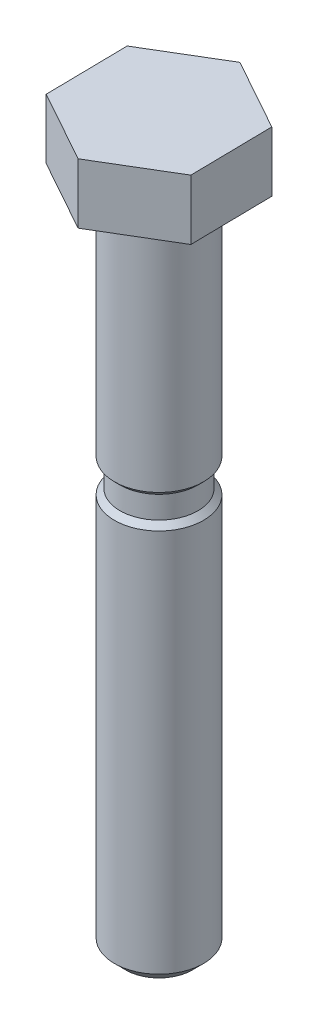
ISO-10303-21;
HEADER;
FILE_DESCRIPTION(('STEP AP214'),'2;1');
FILE_NAME('part.step','',(''),(''),'','','');
FILE_SCHEMA(('AUTOMOTIVE_DESIGN { 1 0 10303 214 1 1 1 1 }'));
ENDSEC;
DATA;
#1=APPLICATION_CONTEXT('core data for automotive mechanical design processes');
#2=APPLICATION_PROTOCOL_DEFINITION('international standard','automotive_design',2000,#1);
#3=PRODUCT_CONTEXT('',#1,'mechanical');
#4=PRODUCT('Part','Part','',(#3));
#5=PRODUCT_RELATED_PRODUCT_CATEGORY('part','',(#4));
#6=PRODUCT_DEFINITION_FORMATION('','',#4);
#7=PRODUCT_DEFINITION_CONTEXT('part definition',#1,'design');
#8=PRODUCT_DEFINITION('design','',#6,#7);
#9=PRODUCT_DEFINITION_SHAPE('','',#8);
#10=(LENGTH_UNIT() NAMED_UNIT(*) SI_UNIT(.MILLI.,.METRE.));
#11=(NAMED_UNIT(*) PLANE_ANGLE_UNIT() SI_UNIT($,.RADIAN.));
#12=(NAMED_UNIT(*) SI_UNIT($,.STERADIAN.) SOLID_ANGLE_UNIT());
#13=UNCERTAINTY_MEASURE_WITH_UNIT(LENGTH_MEASURE(1.E-05),#10,'distance_accuracy_value','');
#14=(GEOMETRIC_REPRESENTATION_CONTEXT(3) GLOBAL_UNCERTAINTY_ASSIGNED_CONTEXT((#13)) GLOBAL_UNIT_ASSIGNED_CONTEXT((#10,
#11,#12)) REPRESENTATION_CONTEXT('',''));
#15=CARTESIAN_POINT('',(0.,0.,0.));
#16=DIRECTION('',(0.,0.,1.));
#17=DIRECTION('',(1.,0.,0.));
#18=AXIS2_PLACEMENT_3D('',#15,#16,#17);
#19=CARTESIAN_POINT('',(0.,-60.,0.));
#20=DIRECTION('',(0.,1.,0.));
#21=DIRECTION('',(0.,0.,1.));
#22=AXIS2_PLACEMENT_3D('',#19,#20,#21);
#23=CYLINDRICAL_SURFACE('',#22,4.);
#24=CARTESIAN_POINT('',(0.,-21.5,0.));
#25=DIRECTION('',(0.,-1.,0.));
#26=DIRECTION('',(0.,0.,-1.));
#27=AXIS2_PLACEMENT_3D('',#24,#25,#26);
#28=CIRCLE('',#27,4.);
#29=CARTESIAN_POINT('',(0.,-21.5,-4.));
#30=VERTEX_POINT('',#29);
#31=EDGE_CURVE('E140',#30,#30,#28,.F.);
#32=ORIENTED_EDGE('',*,*,#31,.T.);
#33=EDGE_LOOP('',(#32));
#34=FACE_BOUND('',#33,.T.);
#35=CARTESIAN_POINT('',(0.,0.,0.));
#36=DIRECTION('',(0.,1.,0.));
#37=DIRECTION('',(0.,0.,1.));
#38=AXIS2_PLACEMENT_3D('',#35,#36,#37);
#39=CIRCLE('',#38,4.);
#40=CARTESIAN_POINT('',(0.,0.,4.));
#41=VERTEX_POINT('',#40);
#42=EDGE_CURVE('E137',#41,#41,#39,.F.);
#43=ORIENTED_EDGE('',*,*,#42,.T.);
#44=EDGE_LOOP('',(#43));
#45=FACE_BOUND('',#44,.T.);
#46=ADVANCED_FACE('F32',(#34,#45),#23,.T.);
#47=CARTESIAN_POINT('',(0.,0.,0.));
#48=DIRECTION('',(0.,1.,0.));
#49=DIRECTION('',(0.,0.,1.));
#50=AXIS2_PLACEMENT_3D('',#47,#48,#49);
#51=PLANE('',#50);
#52=DIRECTION('',(0.858009517698733,0.,-0.513633787380062));
#53=VECTOR('',#52,1.);
#54=CARTESIAN_POINT('',(0.116875272764407,0.,7.389159187888));
#55=LINE('',#54,#53);
#56=CARTESIAN_POINT('',(0.116875272764407,0.,7.389159187888));
#57=VERTEX_POINT('',#56);
#58=CARTESIAN_POINT('',(6.45763720570039,0.,3.5933626386558));
#59=VERTEX_POINT('',#58);
#60=EDGE_CURVE('E118',#57,#59,#55,.T.);
#61=ORIENTED_EDGE('',*,*,#60,.F.);
#62=DIRECTION('',(0.873824666962515,0.,0.486241145325906));
#63=VECTOR('',#62,1.);
#64=CARTESIAN_POINT('',(-6.34076193293599,0.,3.7957965492322));
#65=LINE('',#64,#63);
#66=CARTESIAN_POINT('',(-6.34076193293599,0.,3.7957965492322));
#67=VERTEX_POINT('',#66);
#68=EDGE_CURVE('E78',#67,#57,#65,.T.);
#69=ORIENTED_EDGE('',*,*,#68,.F.);
#70=DIRECTION('',(0.0158151492637824,0.,0.999874932705968));
#71=VECTOR('',#70,1.);
#72=CARTESIAN_POINT('',(-6.4576372057004,0.,-3.59336263865579));
#73=LINE('',#72,#71);
#74=CARTESIAN_POINT('',(-6.4576372057004,0.,-3.59336263865579));
#75=VERTEX_POINT('',#74);
#76=EDGE_CURVE('E72',#75,#67,#73,.T.);
#77=ORIENTED_EDGE('',*,*,#76,.F.);
#78=DIRECTION('',(-0.858009517698734,0.,0.513633787380062));
#79=VECTOR('',#78,1.);
#80=CARTESIAN_POINT('',(-0.116875272764396,0.,-7.389159187888));
#81=LINE('',#80,#79);
#82=CARTESIAN_POINT('',(-0.116875272764396,0.,-7.389159187888));
#83=VERTEX_POINT('',#82);
#84=EDGE_CURVE('E108',#83,#75,#81,.T.);
#85=ORIENTED_EDGE('',*,*,#84,.F.);
#86=DIRECTION('',(-0.873824666962515,0.,-0.486241145325906));
#87=VECTOR('',#86,1.);
#88=CARTESIAN_POINT('',(6.340761932936,0.,-3.7957965492322));
#89=LINE('',#88,#87);
#90=CARTESIAN_POINT('',(6.340761932936,0.,-3.7957965492322));
#91=VERTEX_POINT('',#90);
#92=EDGE_CURVE('E123',#91,#83,#89,.T.);
#93=ORIENTED_EDGE('',*,*,#92,.F.);
#94=DIRECTION('',(-0.0158151492637815,0.,-0.999874932705968));
#95=VECTOR('',#94,1.);
#96=CARTESIAN_POINT('',(6.45763720570039,0.,3.5933626386558));
#97=LINE('',#96,#95);
#98=EDGE_CURVE('E121',#59,#91,#97,.T.);
#99=ORIENTED_EDGE('',*,*,#98,.F.);
#100=EDGE_LOOP('',(#61,#69,#77,#85,#93,#99));
#101=FACE_BOUND('',#100,.T.);
#102=ORIENTED_EDGE('',*,*,#42,.F.);
#103=EDGE_LOOP('',(#102));
#104=FACE_BOUND('',#103,.T.);
#105=ADVANCED_FACE('F166',(#101,#104),#51,.F.);
#106=CARTESIAN_POINT('',(0.116875272764407,5.4,7.389159187888));
#107=DIRECTION('',(-0.513633787380062,0.,-0.858009517698733));
#108=DIRECTION('',(-0.858009517698734,0.,0.513633787380062));
#109=AXIS2_PLACEMENT_3D('',#106,#107,#108);
#110=PLANE('',#109);
#111=ORIENTED_EDGE('',*,*,#60,.T.);
#112=DIRECTION('',(0.,-1.,0.));
#113=VECTOR('',#112,1.);
#114=CARTESIAN_POINT('',(6.45763720570039,5.4,3.5933626386558));
#115=LINE('',#114,#113);
#116=CARTESIAN_POINT('',(6.45763720570039,5.4,3.5933626386558));
#117=VERTEX_POINT('',#116);
#118=EDGE_CURVE('E135',#117,#59,#115,.T.);
#119=ORIENTED_EDGE('',*,*,#118,.F.);
#120=DIRECTION('',(0.858009517698733,0.,-0.513633787380062));
#121=VECTOR('',#120,1.);
#122=CARTESIAN_POINT('',(0.116875272764407,5.4,7.389159187888));
#123=LINE('',#122,#121);
#124=CARTESIAN_POINT('',(0.116875272764407,5.4,7.389159187888));
#125=VERTEX_POINT('',#124);
#126=EDGE_CURVE('E128',#125,#117,#123,.T.);
#127=ORIENTED_EDGE('',*,*,#126,.F.);
#128=DIRECTION('',(0.,-1.,0.));
#129=VECTOR('',#128,1.);
#130=CARTESIAN_POINT('',(0.116875272764407,5.4,7.389159187888));
#131=LINE('',#130,#129);
#132=EDGE_CURVE('E114',#125,#57,#131,.T.);
#133=ORIENTED_EDGE('',*,*,#132,.T.);
#134=EDGE_LOOP('',(#111,#119,#127,#133));
#135=FACE_BOUND('',#134,.T.);
#136=ADVANCED_FACE('F173',(#135),#110,.F.);
#137=CARTESIAN_POINT('',(6.45763720570039,5.4,3.5933626386558));
#138=DIRECTION('',(-0.999874932705968,0.,0.0158151492637815));
#139=DIRECTION('',(0.0158151492637815,0.,0.999874932705968));
#140=AXIS2_PLACEMENT_3D('',#137,#138,#139);
#141=PLANE('',#140);
#142=ORIENTED_EDGE('',*,*,#98,.T.);
#143=DIRECTION('',(0.,-1.,0.));
#144=VECTOR('',#143,1.);
#145=CARTESIAN_POINT('',(6.340761932936,5.4,-3.7957965492322));
#146=LINE('',#145,#144);
#147=CARTESIAN_POINT('',(6.340761932936,5.4,-3.7957965492322));
#148=VERTEX_POINT('',#147);
#149=EDGE_CURVE('E132',#148,#91,#146,.T.);
#150=ORIENTED_EDGE('',*,*,#149,.F.);
#151=DIRECTION('',(-0.0158151492637815,0.,-0.999874932705968));
#152=VECTOR('',#151,1.);
#153=CARTESIAN_POINT('',(6.45763720570039,5.4,3.5933626386558));
#154=LINE('',#153,#152);
#155=EDGE_CURVE('E87',#117,#148,#154,.T.);
#156=ORIENTED_EDGE('',*,*,#155,.F.);
#157=ORIENTED_EDGE('',*,*,#118,.T.);
#158=EDGE_LOOP('',(#142,#150,#156,#157));
#159=FACE_BOUND('',#158,.T.);
#160=ADVANCED_FACE('F216',(#159),#141,.F.);
#161=CARTESIAN_POINT('',(6.340761932936,5.4,-3.7957965492322));
#162=DIRECTION('',(-0.486241145325906,0.,0.873824666962515));
#163=DIRECTION('',(0.873824666962515,0.,0.486241145325906));
#164=AXIS2_PLACEMENT_3D('',#161,#162,#163);
#165=PLANE('',#164);
#166=ORIENTED_EDGE('',*,*,#92,.T.);
#167=DIRECTION('',(0.,-1.,0.));
#168=VECTOR('',#167,1.);
#169=CARTESIAN_POINT('',(-0.116875272764396,5.4,-7.389159187888));
#170=LINE('',#169,#168);
#171=CARTESIAN_POINT('',(-0.116875272764396,5.4,-7.389159187888));
#172=VERTEX_POINT('',#171);
#173=EDGE_CURVE('E109',#172,#83,#170,.T.);
#174=ORIENTED_EDGE('',*,*,#173,.F.);
#175=DIRECTION('',(-0.873824666962515,0.,-0.486241145325906));
#176=VECTOR('',#175,1.);
#177=CARTESIAN_POINT('',(6.340761932936,5.4,-3.7957965492322));
#178=LINE('',#177,#176);
#179=EDGE_CURVE('E100',#148,#172,#178,.T.);
#180=ORIENTED_EDGE('',*,*,#179,.F.);
#181=ORIENTED_EDGE('',*,*,#149,.T.);
#182=EDGE_LOOP('',(#166,#174,#180,#181));
#183=FACE_BOUND('',#182,.T.);
#184=ADVANCED_FACE('F213',(#183),#165,.F.);
#185=CARTESIAN_POINT('',(-0.116875272764396,5.4,-7.389159187888));
#186=DIRECTION('',(0.513633787380062,0.,0.858009517698734));
#187=DIRECTION('',(0.858009517698734,0.,-0.513633787380062));
#188=AXIS2_PLACEMENT_3D('',#185,#186,#187);
#189=PLANE('',#188);
#190=ORIENTED_EDGE('',*,*,#84,.T.);
#191=DIRECTION('',(0.,-1.,0.));
#192=VECTOR('',#191,1.);
#193=CARTESIAN_POINT('',(-6.4576372057004,5.4,-3.59336263865579));
#194=LINE('',#193,#192);
#195=CARTESIAN_POINT('',(-6.4576372057004,5.4,-3.59336263865579));
#196=VERTEX_POINT('',#195);
#197=EDGE_CURVE('E105',#196,#75,#194,.T.);
#198=ORIENTED_EDGE('',*,*,#197,.F.);
#199=DIRECTION('',(-0.858009517698734,0.,0.513633787380062));
#200=VECTOR('',#199,1.);
#201=CARTESIAN_POINT('',(-0.116875272764396,5.4,-7.389159187888));
#202=LINE('',#201,#200);
#203=EDGE_CURVE('E94',#172,#196,#202,.T.);
#204=ORIENTED_EDGE('',*,*,#203,.F.);
#205=ORIENTED_EDGE('',*,*,#173,.T.);
#206=EDGE_LOOP('',(#190,#198,#204,#205));
#207=FACE_BOUND('',#206,.T.);
#208=ADVANCED_FACE('F106',(#207),#189,.F.);
#209=CARTESIAN_POINT('',(-6.4576372057004,5.4,-3.59336263865579));
#210=DIRECTION('',(0.999874932705968,0.,-0.0158151492637825));
#211=DIRECTION('',(-0.0158151492637825,0.,-0.999874932705968));
#212=AXIS2_PLACEMENT_3D('',#209,#210,#211);
#213=PLANE('',#212);
#214=ORIENTED_EDGE('',*,*,#76,.T.);
#215=DIRECTION('',(0.,-1.,0.));
#216=VECTOR('',#215,1.);
#217=CARTESIAN_POINT('',(-6.34076193293599,5.4,3.7957965492322));
#218=LINE('',#217,#216);
#219=CARTESIAN_POINT('',(-6.34076193293599,5.4,3.7957965492322));
#220=VERTEX_POINT('',#219);
#221=EDGE_CURVE('E110',#220,#67,#218,.T.);
#222=ORIENTED_EDGE('',*,*,#221,.F.);
#223=DIRECTION('',(0.0158151492637824,0.,0.999874932705968));
#224=VECTOR('',#223,1.);
#225=CARTESIAN_POINT('',(-6.4576372057004,5.4,-3.59336263865579));
#226=LINE('',#225,#224);
#227=EDGE_CURVE('E98',#196,#220,#226,.T.);
#228=ORIENTED_EDGE('',*,*,#227,.F.);
#229=ORIENTED_EDGE('',*,*,#197,.T.);
#230=EDGE_LOOP('',(#214,#222,#228,#229));
#231=FACE_BOUND('',#230,.T.);
#232=ADVANCED_FACE('F112',(#231),#213,.F.);
#233=CARTESIAN_POINT('',(-6.34076193293599,5.4,3.7957965492322));
#234=DIRECTION('',(0.486241145325906,0.,-0.873824666962515));
#235=DIRECTION('',(-0.873824666962515,0.,-0.486241145325906));
#236=AXIS2_PLACEMENT_3D('',#233,#234,#235);
#237=PLANE('',#236);
#238=ORIENTED_EDGE('',*,*,#68,.T.);
#239=ORIENTED_EDGE('',*,*,#132,.F.);
#240=DIRECTION('',(0.873824666962515,0.,0.486241145325906));
#241=VECTOR('',#240,1.);
#242=CARTESIAN_POINT('',(-6.34076193293599,5.4,3.7957965492322));
#243=LINE('',#242,#241);
#244=EDGE_CURVE('E49',#220,#125,#243,.T.);
#245=ORIENTED_EDGE('',*,*,#244,.F.);
#246=ORIENTED_EDGE('',*,*,#221,.T.);
#247=EDGE_LOOP('',(#238,#239,#245,#246));
#248=FACE_BOUND('',#247,.T.);
#249=ADVANCED_FACE('F199',(#248),#237,.F.);
#250=CARTESIAN_POINT('',(0.,5.4,0.));
#251=DIRECTION('',(0.,1.,0.));
#252=DIRECTION('',(0.,0.,1.));
#253=AXIS2_PLACEMENT_3D('',#250,#251,#252);
#254=PLANE('',#253);
#255=ORIENTED_EDGE('',*,*,#126,.T.);
#256=ORIENTED_EDGE('',*,*,#155,.T.);
#257=ORIENTED_EDGE('',*,*,#179,.T.);
#258=ORIENTED_EDGE('',*,*,#203,.T.);
#259=ORIENTED_EDGE('',*,*,#227,.T.);
#260=ORIENTED_EDGE('',*,*,#244,.T.);
#261=EDGE_LOOP('',(#255,#256,#257,#258,#259,#260));
#262=FACE_BOUND('',#261,.T.);
#263=ADVANCED_FACE('F96',(#262),#254,.T.);
#264=CARTESIAN_POINT('',(0.,-22.,0.));
#265=DIRECTION('',(0.,-1.,0.));
#266=DIRECTION('',(0.,0.,-1.));
#267=AXIS2_PLACEMENT_3D('',#264,#265,#266);
#268=CYLINDRICAL_SURFACE('',#267,3.50321700563321);
#269=CARTESIAN_POINT('',(0.,-24.0032170056332,0.));
#270=DIRECTION('',(0.,-1.,0.));
#271=DIRECTION('',(0.,0.,-1.));
#272=AXIS2_PLACEMENT_3D('',#269,#270,#271);
#273=CIRCLE('',#272,3.50321700563321);
#274=CARTESIAN_POINT('',(0.,-24.0032170056332,-3.50321700563321));
#275=VERTEX_POINT('',#274);
#276=EDGE_CURVE('E149',#275,#275,#273,.F.);
#277=ORIENTED_EDGE('',*,*,#276,.T.);
#278=EDGE_LOOP('',(#277));
#279=FACE_BOUND('',#278,.T.);
#280=CARTESIAN_POINT('',(0.,-21.9967829943668,0.));
#281=DIRECTION('',(0.,1.,0.));
#282=DIRECTION('',(0.,0.,1.));
#283=AXIS2_PLACEMENT_3D('',#280,#281,#282);
#284=CIRCLE('',#283,3.50321700563321);
#285=CARTESIAN_POINT('',(0.,-21.9967829943668,3.50321700563321));
#286=VERTEX_POINT('',#285);
#287=EDGE_CURVE('E146',#286,#286,#284,.F.);
#288=ORIENTED_EDGE('',*,*,#287,.T.);
#289=EDGE_LOOP('',(#288));
#290=FACE_BOUND('',#289,.T.);
#291=ADVANCED_FACE('F187',(#279,#290),#268,.T.);
#292=CARTESIAN_POINT('',(0.,-60.,0.));
#293=DIRECTION('',(0.,-1.,0.));
#294=DIRECTION('',(0.,0.,-1.));
#295=AXIS2_PLACEMENT_3D('',#292,#293,#294);
#296=PLANE('',#295);
#297=CARTESIAN_POINT('',(0.,-60.,0.));
#298=DIRECTION('',(0.,-1.,0.));
#299=DIRECTION('',(0.,0.,-1.));
#300=AXIS2_PLACEMENT_3D('',#297,#298,#299);
#301=CIRCLE('',#300,3.);
#302=CARTESIAN_POINT('',(0.,-60.,-3.));
#303=VERTEX_POINT('',#302);
#304=EDGE_CURVE('E41',#303,#303,#301,.T.);
#305=ORIENTED_EDGE('',*,*,#304,.T.);
#306=EDGE_LOOP('',(#305));
#307=FACE_BOUND('',#306,.T.);
#308=ADVANCED_FACE('F154',(#307),#296,.T.);
#309=CARTESIAN_POINT('',(0.,-59.,0.));
#310=DIRECTION('',(0.,-1.,0.));
#311=DIRECTION('',(0.,0.,-1.));
#312=AXIS2_PLACEMENT_3D('',#309,#310,#311);
#313=CIRCLE('',#312,4.);
#314=CARTESIAN_POINT('',(0.,-59.,-4.));
#315=VERTEX_POINT('',#314);
#316=EDGE_CURVE('E11',#315,#315,#313,.F.);
#317=ORIENTED_EDGE('',*,*,#316,.T.);
#318=EDGE_LOOP('',(#317));
#319=FACE_BOUND('',#318,.T.);
#320=CARTESIAN_POINT('',(0.,-24.5,0.));
#321=DIRECTION('',(0.,-1.,0.));
#322=DIRECTION('',(0.,0.,-1.));
#323=AXIS2_PLACEMENT_3D('',#320,#321,#322);
#324=CIRCLE('',#323,4.);
#325=CARTESIAN_POINT('',(0.,-24.5,-4.));
#326=VERTEX_POINT('',#325);
#327=EDGE_CURVE('E143',#326,#326,#324,.T.);
#328=ORIENTED_EDGE('',*,*,#327,.T.);
#329=EDGE_LOOP('',(#328));
#330=FACE_BOUND('',#329,.T.);
#331=ADVANCED_FACE('F169',(#319,#330),#23,.T.);
#332=CARTESIAN_POINT('',(0.,-22.,0.));
#333=DIRECTION('',(0.,1.,0.));
#334=DIRECTION('',(0.,0.,1.));
#335=AXIS2_PLACEMENT_3D('',#332,#333,#334);
#336=CONICAL_SURFACE('',#335,3.49999999999999,0.78539816339745);
#337=ORIENTED_EDGE('',*,*,#31,.F.);
#338=EDGE_LOOP('',(#337));
#339=FACE_BOUND('',#338,.T.);
#340=ORIENTED_EDGE('',*,*,#287,.F.);
#341=EDGE_LOOP('',(#340));
#342=FACE_BOUND('',#341,.T.);
#343=ADVANCED_FACE('F162',(#339,#342),#336,.T.);
#344=CARTESIAN_POINT('',(0.,-24.5,0.));
#345=DIRECTION('',(0.,-1.,0.));
#346=DIRECTION('',(0.,0.,-1.));
#347=AXIS2_PLACEMENT_3D('',#344,#345,#346);
#348=CONICAL_SURFACE('',#347,4.,0.785398163397445);
#349=ORIENTED_EDGE('',*,*,#276,.F.);
#350=EDGE_LOOP('',(#349));
#351=FACE_BOUND('',#350,.T.);
#352=ORIENTED_EDGE('',*,*,#327,.F.);
#353=EDGE_LOOP('',(#352));
#354=FACE_BOUND('',#353,.T.);
#355=ADVANCED_FACE('F157',(#351,#354),#348,.T.);
#356=CARTESIAN_POINT('',(0.,-60.,0.));
#357=DIRECTION('',(0.,1.,0.));
#358=DIRECTION('',(0.,0.,1.));
#359=AXIS2_PLACEMENT_3D('',#356,#357,#358);
#360=CONICAL_SURFACE('',#359,3.,0.785398163397443);
#361=ORIENTED_EDGE('',*,*,#316,.F.);
#362=EDGE_LOOP('',(#361));
#363=FACE_BOUND('',#362,.T.);
#364=ORIENTED_EDGE('',*,*,#304,.F.);
#365=EDGE_LOOP('',(#364));
#366=FACE_BOUND('',#365,.T.);
#367=ADVANCED_FACE('F34',(#363,#366),#360,.T.);
#368=CLOSED_SHELL('',(#46,#105,#136,#160,#184,#208,#232,#249,#263,#291,#308,#331,#343,#355,#367));
#369=MANIFOLD_SOLID_BREP('B2',#368);
#370=ADVANCED_BREP_SHAPE_REPRESENTATION('',(#18,#369),#14);
#371=SHAPE_DEFINITION_REPRESENTATION(#9,#370);
ENDSEC;
END-ISO-10303-21;
